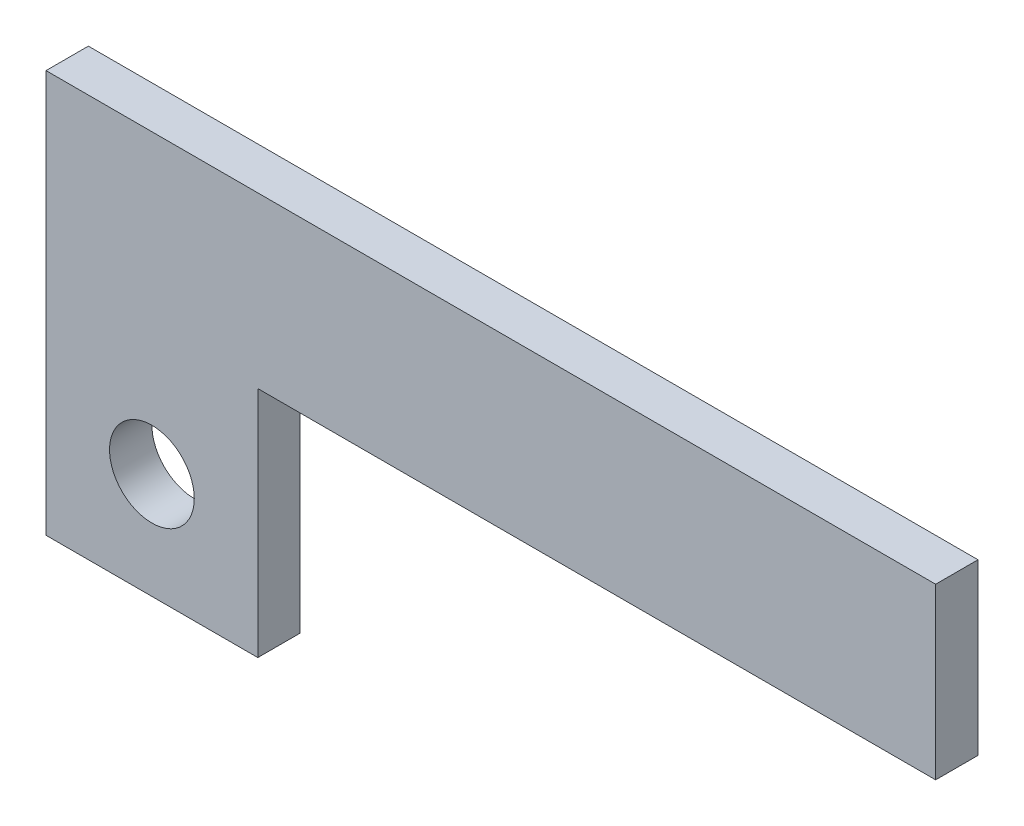
ISO-10303-21;
HEADER;
FILE_DESCRIPTION(('STEP AP214'),'2;1');
FILE_NAME('part.step','',(''),(''),'','','');
FILE_SCHEMA(('AUTOMOTIVE_DESIGN { 1 0 10303 214 1 1 1 1 }'));
ENDSEC;
DATA;
#1=APPLICATION_CONTEXT('core data for automotive mechanical design processes');
#2=APPLICATION_PROTOCOL_DEFINITION('international standard','automotive_design',2000,#1);
#3=PRODUCT_CONTEXT('',#1,'mechanical');
#4=PRODUCT('Part','Part','',(#3));
#5=PRODUCT_RELATED_PRODUCT_CATEGORY('part','',(#4));
#6=PRODUCT_DEFINITION_FORMATION('','',#4);
#7=PRODUCT_DEFINITION_CONTEXT('part definition',#1,'design');
#8=PRODUCT_DEFINITION('design','',#6,#7);
#9=PRODUCT_DEFINITION_SHAPE('','',#8);
#10=(LENGTH_UNIT() NAMED_UNIT(*) SI_UNIT(.MILLI.,.METRE.));
#11=(NAMED_UNIT(*) PLANE_ANGLE_UNIT() SI_UNIT($,.RADIAN.));
#12=(NAMED_UNIT(*) SI_UNIT($,.STERADIAN.) SOLID_ANGLE_UNIT());
#13=UNCERTAINTY_MEASURE_WITH_UNIT(LENGTH_MEASURE(1.E-05),#10,'distance_accuracy_value','');
#14=(GEOMETRIC_REPRESENTATION_CONTEXT(3) GLOBAL_UNCERTAINTY_ASSIGNED_CONTEXT((#13)) GLOBAL_UNIT_ASSIGNED_CONTEXT((#10,
#11,#12)) REPRESENTATION_CONTEXT('',''));
#15=CARTESIAN_POINT('',(0.,0.,0.));
#16=DIRECTION('',(0.,0.,1.));
#17=DIRECTION('',(1.,0.,0.));
#18=AXIS2_PLACEMENT_3D('',#15,#16,#17);
#19=CARTESIAN_POINT('',(10.,11.,0.));
#20=DIRECTION('',(0.,1.,0.));
#21=DIRECTION('',(0.,0.,1.));
#22=AXIS2_PLACEMENT_3D('',#19,#20,#21);
#23=PLANE('',#22);
#24=DIRECTION('',(-1.,0.,0.));
#25=VECTOR('',#24,1.);
#26=CARTESIAN_POINT('',(10.,11.,0.));
#27=LINE('',#26,#25);
#28=CARTESIAN_POINT('',(42.,11.,0.));
#29=VERTEX_POINT('',#28);
#30=CARTESIAN_POINT('',(10.,11.,0.));
#31=VERTEX_POINT('',#30);
#32=EDGE_CURVE('E89',#29,#31,#27,.T.);
#33=ORIENTED_EDGE('',*,*,#32,.F.);
#34=DIRECTION('',(0.,0.,1.));
#35=VECTOR('',#34,1.);
#36=CARTESIAN_POINT('',(42.,11.,0.));
#37=LINE('',#36,#35);
#38=CARTESIAN_POINT('',(42.,11.,2.));
#39=VERTEX_POINT('',#38);
#40=EDGE_CURVE('E91',#29,#39,#37,.T.);
#41=ORIENTED_EDGE('',*,*,#40,.T.);
#42=DIRECTION('',(1.,0.,0.));
#43=VECTOR('',#42,1.);
#44=CARTESIAN_POINT('',(0.,11.,2.));
#45=LINE('',#44,#43);
#46=CARTESIAN_POINT('',(10.,11.,2.));
#47=VERTEX_POINT('',#46);
#48=EDGE_CURVE('E68',#47,#39,#45,.T.);
#49=ORIENTED_EDGE('',*,*,#48,.F.);
#50=DIRECTION('',(0.,0.,1.));
#51=VECTOR('',#50,1.);
#52=CARTESIAN_POINT('',(10.,11.,0.));
#53=LINE('',#52,#51);
#54=EDGE_CURVE('E93',#31,#47,#53,.T.);
#55=ORIENTED_EDGE('',*,*,#54,.F.);
#56=EDGE_LOOP('',(#33,#41,#49,#55));
#57=FACE_BOUND('',#56,.T.);
#58=ADVANCED_FACE('F36',(#57),#23,.F.);
#59=CARTESIAN_POINT('',(13.,0.,2.15));
#60=DIRECTION('',(0.,-1.,0.));
#61=DIRECTION('',(0.,0.,-1.));
#62=AXIS2_PLACEMENT_3D('',#59,#60,#61);
#63=PLANE('',#62);
#64=DIRECTION('',(0.,0.,1.));
#65=VECTOR('',#64,1.);
#66=CARTESIAN_POINT('',(10.,0.,0.));
#67=LINE('',#66,#65);
#68=CARTESIAN_POINT('',(10.,0.,0.));
#69=VERTEX_POINT('',#68);
#70=CARTESIAN_POINT('',(10.,0.,2.));
#71=VERTEX_POINT('',#70);
#72=EDGE_CURVE('E98',#69,#71,#67,.T.);
#73=ORIENTED_EDGE('',*,*,#72,.T.);
#74=DIRECTION('',(1.,0.,0.));
#75=VECTOR('',#74,1.);
#76=CARTESIAN_POINT('',(0.,0.,2.));
#77=LINE('',#76,#75);
#78=CARTESIAN_POINT('',(0.,0.,2.));
#79=VERTEX_POINT('',#78);
#80=EDGE_CURVE('E133',#79,#71,#77,.T.);
#81=ORIENTED_EDGE('',*,*,#80,.F.);
#82=DIRECTION('',(0.,0.,-1.));
#83=VECTOR('',#82,1.);
#84=CARTESIAN_POINT('',(0.,0.,2.));
#85=LINE('',#84,#83);
#86=CARTESIAN_POINT('',(0.,0.,0.));
#87=VERTEX_POINT('',#86);
#88=EDGE_CURVE('E139',#79,#87,#85,.T.);
#89=ORIENTED_EDGE('',*,*,#88,.T.);
#90=DIRECTION('',(1.,0.,0.));
#91=VECTOR('',#90,1.);
#92=CARTESIAN_POINT('',(0.,0.,0.));
#93=LINE('',#92,#91);
#94=EDGE_CURVE('E130',#87,#69,#93,.T.);
#95=ORIENTED_EDGE('',*,*,#94,.T.);
#96=EDGE_LOOP('',(#73,#81,#89,#95));
#97=FACE_BOUND('',#96,.T.);
#98=ADVANCED_FACE('F38',(#97),#63,.T.);
#99=CARTESIAN_POINT('',(0.,19.,0.));
#100=DIRECTION('',(0.,0.,-1.));
#101=DIRECTION('',(-1.,0.,0.));
#102=AXIS2_PLACEMENT_3D('',#99,#100,#101);
#103=PLANE('',#102);
#104=DIRECTION('',(1.,0.,0.));
#105=VECTOR('',#104,1.);
#106=CARTESIAN_POINT('',(0.,19.,0.));
#107=LINE('',#106,#105);
#108=CARTESIAN_POINT('',(0.,19.,0.));
#109=VERTEX_POINT('',#108);
#110=CARTESIAN_POINT('',(42.,19.,0.));
#111=VERTEX_POINT('',#110);
#112=EDGE_CURVE('E113',#109,#111,#107,.T.);
#113=ORIENTED_EDGE('',*,*,#112,.T.);
#114=DIRECTION('',(0.,1.,0.));
#115=VECTOR('',#114,1.);
#116=CARTESIAN_POINT('',(42.,19.,0.));
#117=LINE('',#116,#115);
#118=EDGE_CURVE('E105',#29,#111,#117,.T.);
#119=ORIENTED_EDGE('',*,*,#118,.F.);
#120=ORIENTED_EDGE('',*,*,#32,.T.);
#121=DIRECTION('',(0.,-1.,0.));
#122=VECTOR('',#121,1.);
#123=CARTESIAN_POINT('',(10.,0.,0.));
#124=LINE('',#123,#122);
#125=EDGE_CURVE('E99',#31,#69,#124,.T.);
#126=ORIENTED_EDGE('',*,*,#125,.T.);
#127=ORIENTED_EDGE('',*,*,#94,.F.);
#128=DIRECTION('',(0.,-1.,0.));
#129=VECTOR('',#128,1.);
#130=CARTESIAN_POINT('',(0.,19.,0.));
#131=LINE('',#130,#129);
#132=EDGE_CURVE('E45',#109,#87,#131,.T.);
#133=ORIENTED_EDGE('',*,*,#132,.F.);
#134=EDGE_LOOP('',(#113,#119,#120,#126,#127,#133));
#135=FACE_BOUND('',#134,.T.);
#136=CARTESIAN_POINT('',(5.,5.,0.));
#137=DIRECTION('',(0.,0.,1.));
#138=DIRECTION('',(1.,0.,0.));
#139=AXIS2_PLACEMENT_3D('',#136,#137,#138);
#140=CIRCLE('',#139,2.);
#141=CARTESIAN_POINT('',(7.,5.,0.));
#142=VERTEX_POINT('',#141);
#143=EDGE_CURVE('E120',#142,#142,#140,.T.);
#144=ORIENTED_EDGE('',*,*,#143,.T.);
#145=EDGE_LOOP('',(#144));
#146=FACE_BOUND('',#145,.T.);
#147=ADVANCED_FACE('F110',(#135,#146),#103,.T.);
#148=CARTESIAN_POINT('',(0.,19.,2.));
#149=DIRECTION('',(-1.,0.,0.));
#150=DIRECTION('',(0.,0.,1.));
#151=AXIS2_PLACEMENT_3D('',#148,#149,#150);
#152=PLANE('',#151);
#153=ORIENTED_EDGE('',*,*,#88,.F.);
#154=DIRECTION('',(0.,-1.,0.));
#155=VECTOR('',#154,1.);
#156=CARTESIAN_POINT('',(0.,19.,2.));
#157=LINE('',#156,#155);
#158=CARTESIAN_POINT('',(0.,19.,2.));
#159=VERTEX_POINT('',#158);
#160=EDGE_CURVE('E53',#159,#79,#157,.T.);
#161=ORIENTED_EDGE('',*,*,#160,.F.);
#162=DIRECTION('',(0.,0.,-1.));
#163=VECTOR('',#162,1.);
#164=CARTESIAN_POINT('',(0.,19.,2.));
#165=LINE('',#164,#163);
#166=EDGE_CURVE('E132',#159,#109,#165,.T.);
#167=ORIENTED_EDGE('',*,*,#166,.T.);
#168=ORIENTED_EDGE('',*,*,#132,.T.);
#169=EDGE_LOOP('',(#153,#161,#167,#168));
#170=FACE_BOUND('',#169,.T.);
#171=ADVANCED_FACE('F149',(#170),#152,.T.);
#172=CARTESIAN_POINT('',(0.,19.,2.));
#173=DIRECTION('',(0.,0.,-1.));
#174=DIRECTION('',(-1.,0.,0.));
#175=AXIS2_PLACEMENT_3D('',#172,#173,#174);
#176=PLANE('',#175);
#177=CARTESIAN_POINT('',(5.,5.,2.));
#178=DIRECTION('',(0.,0.,1.));
#179=DIRECTION('',(1.,0.,0.));
#180=AXIS2_PLACEMENT_3D('',#177,#178,#179);
#181=CIRCLE('',#180,2.);
#182=CARTESIAN_POINT('',(7.,5.,2.));
#183=VERTEX_POINT('',#182);
#184=EDGE_CURVE('E118',#183,#183,#181,.T.);
#185=ORIENTED_EDGE('',*,*,#184,.F.);
#186=EDGE_LOOP('',(#185));
#187=FACE_BOUND('',#186,.T.);
#188=ORIENTED_EDGE('',*,*,#48,.T.);
#189=DIRECTION('',(0.,1.,0.));
#190=VECTOR('',#189,1.);
#191=CARTESIAN_POINT('',(42.,19.,2.));
#192=LINE('',#191,#190);
#193=CARTESIAN_POINT('',(42.,19.,2.));
#194=VERTEX_POINT('',#193);
#195=EDGE_CURVE('E107',#39,#194,#192,.T.);
#196=ORIENTED_EDGE('',*,*,#195,.T.);
#197=DIRECTION('',(1.,0.,0.));
#198=VECTOR('',#197,1.);
#199=CARTESIAN_POINT('',(0.,19.,2.));
#200=LINE('',#199,#198);
#201=EDGE_CURVE('E135',#159,#194,#200,.T.);
#202=ORIENTED_EDGE('',*,*,#201,.F.);
#203=ORIENTED_EDGE('',*,*,#160,.T.);
#204=ORIENTED_EDGE('',*,*,#80,.T.);
#205=DIRECTION('',(0.,1.,0.));
#206=VECTOR('',#205,1.);
#207=CARTESIAN_POINT('',(10.,19.,2.));
#208=LINE('',#207,#206);
#209=EDGE_CURVE('E11',#71,#47,#208,.T.);
#210=ORIENTED_EDGE('',*,*,#209,.T.);
#211=EDGE_LOOP('',(#188,#196,#202,#203,#204,#210));
#212=FACE_BOUND('',#211,.T.);
#213=ADVANCED_FACE('F146',(#187,#212),#176,.F.);
#214=CARTESIAN_POINT('',(15.15,19.,3.85));
#215=DIRECTION('',(0.,-1.,0.));
#216=DIRECTION('',(-1.,0.,0.));
#217=AXIS2_PLACEMENT_3D('',#214,#215,#216);
#218=PLANE('',#217);
#219=ORIENTED_EDGE('',*,*,#201,.T.);
#220=DIRECTION('',(0.,0.,1.));
#221=VECTOR('',#220,1.);
#222=CARTESIAN_POINT('',(42.,19.,0.));
#223=LINE('',#222,#221);
#224=EDGE_CURVE('E108',#111,#194,#223,.T.);
#225=ORIENTED_EDGE('',*,*,#224,.F.);
#226=ORIENTED_EDGE('',*,*,#112,.F.);
#227=ORIENTED_EDGE('',*,*,#166,.F.);
#228=EDGE_LOOP('',(#219,#225,#226,#227));
#229=FACE_BOUND('',#228,.T.);
#230=ADVANCED_FACE('F156',(#229),#218,.F.);
#231=CARTESIAN_POINT('',(10.,0.,0.));
#232=DIRECTION('',(-1.,0.,0.));
#233=DIRECTION('',(0.,0.,1.));
#234=AXIS2_PLACEMENT_3D('',#231,#232,#233);
#235=PLANE('',#234);
#236=ORIENTED_EDGE('',*,*,#72,.F.);
#237=ORIENTED_EDGE('',*,*,#125,.F.);
#238=ORIENTED_EDGE('',*,*,#54,.T.);
#239=ORIENTED_EDGE('',*,*,#209,.F.);
#240=EDGE_LOOP('',(#236,#237,#238,#239));
#241=FACE_BOUND('',#240,.T.);
#242=ADVANCED_FACE('F168',(#241),#235,.F.);
#243=CARTESIAN_POINT('',(5.,5.,0.));
#244=DIRECTION('',(0.,0.,1.));
#245=DIRECTION('',(1.,0.,0.));
#246=AXIS2_PLACEMENT_3D('',#243,#244,#245);
#247=CYLINDRICAL_SURFACE('',#246,2.);
#248=ORIENTED_EDGE('',*,*,#143,.F.);
#249=EDGE_LOOP('',(#248));
#250=FACE_BOUND('',#249,.T.);
#251=ORIENTED_EDGE('',*,*,#184,.T.);
#252=EDGE_LOOP('',(#251));
#253=FACE_BOUND('',#252,.T.);
#254=ADVANCED_FACE('F166',(#250,#253),#247,.F.);
#255=CARTESIAN_POINT('',(42.,19.,0.));
#256=DIRECTION('',(1.,0.,0.));
#257=DIRECTION('',(0.,0.,-1.));
#258=AXIS2_PLACEMENT_3D('',#255,#256,#257);
#259=PLANE('',#258);
#260=ORIENTED_EDGE('',*,*,#195,.F.);
#261=ORIENTED_EDGE('',*,*,#40,.F.);
#262=ORIENTED_EDGE('',*,*,#118,.T.);
#263=ORIENTED_EDGE('',*,*,#224,.T.);
#264=EDGE_LOOP('',(#260,#261,#262,#263));
#265=FACE_BOUND('',#264,.T.);
#266=ADVANCED_FACE('F103',(#265),#259,.T.);
#267=CLOSED_SHELL('',(#58,#98,#147,#171,#213,#230,#242,#254,#266));
#268=MANIFOLD_SOLID_BREP('B2',#267);
#269=ADVANCED_BREP_SHAPE_REPRESENTATION('',(#18,#268),#14);
#270=SHAPE_DEFINITION_REPRESENTATION(#9,#269);
ENDSEC;
END-ISO-10303-21;
